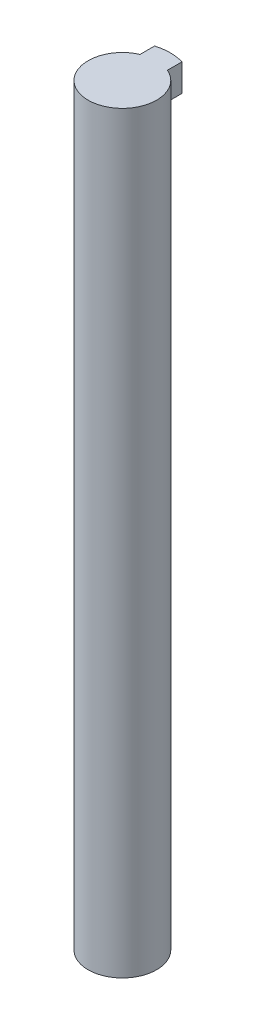
ISO-10303-21;
HEADER;
FILE_DESCRIPTION(('STEP AP214'),'2;1');
FILE_NAME('part.step','',(''),(''),'','','');
FILE_SCHEMA(('AUTOMOTIVE_DESIGN { 1 0 10303 214 1 1 1 1 }'));
ENDSEC;
DATA;
#1=APPLICATION_CONTEXT('core data for automotive mechanical design processes');
#2=APPLICATION_PROTOCOL_DEFINITION('international standard','automotive_design',2000,#1);
#3=PRODUCT_CONTEXT('',#1,'mechanical');
#4=PRODUCT('Part','Part','',(#3));
#5=PRODUCT_RELATED_PRODUCT_CATEGORY('part','',(#4));
#6=PRODUCT_DEFINITION_FORMATION('','',#4);
#7=PRODUCT_DEFINITION_CONTEXT('part definition',#1,'design');
#8=PRODUCT_DEFINITION('design','',#6,#7);
#9=PRODUCT_DEFINITION_SHAPE('','',#8);
#10=(LENGTH_UNIT() NAMED_UNIT(*) SI_UNIT(.MILLI.,.METRE.));
#11=(NAMED_UNIT(*) PLANE_ANGLE_UNIT() SI_UNIT($,.RADIAN.));
#12=(NAMED_UNIT(*) SI_UNIT($,.STERADIAN.) SOLID_ANGLE_UNIT());
#13=UNCERTAINTY_MEASURE_WITH_UNIT(LENGTH_MEASURE(1.E-05),#10,'distance_accuracy_value','');
#14=(GEOMETRIC_REPRESENTATION_CONTEXT(3) GLOBAL_UNCERTAINTY_ASSIGNED_CONTEXT((#13)) GLOBAL_UNIT_ASSIGNED_CONTEXT((#10,
#11,#12)) REPRESENTATION_CONTEXT('',''));
#15=CARTESIAN_POINT('',(0.,0.,0.));
#16=DIRECTION('',(0.,0.,1.));
#17=DIRECTION('',(1.,0.,0.));
#18=AXIS2_PLACEMENT_3D('',#15,#16,#17);
#19=CARTESIAN_POINT('',(0.,69.85,0.));
#20=DIRECTION('',(0.,-1.,0.));
#21=DIRECTION('',(0.,0.,-1.));
#22=AXIS2_PLACEMENT_3D('',#19,#20,#21);
#23=CYLINDRICAL_SURFACE('',#22,3.175);
#24=CARTESIAN_POINT('',(0.,67.31,0.));
#25=DIRECTION('',(0.,-1.,0.));
#26=DIRECTION('',(0.,0.,1.));
#27=AXIS2_PLACEMENT_3D('',#24,#25,#26);
#28=CIRCLE('',#27,3.175);
#29=CARTESIAN_POINT('',(-1.27,67.31,-2.90993556629696));
#30=VERTEX_POINT('',#29);
#31=CARTESIAN_POINT('',(1.27,67.31,-2.90993556629696));
#32=VERTEX_POINT('',#31);
#33=EDGE_CURVE('E81',#30,#32,#28,.T.);
#34=ORIENTED_EDGE('',*,*,#33,.T.);
#35=DIRECTION('',(0.,1.,0.));
#36=VECTOR('',#35,1.);
#37=CARTESIAN_POINT('',(1.27,67.31,-2.90993556629696));
#38=LINE('',#37,#36);
#39=CARTESIAN_POINT('',(1.27,69.85,-2.90993556629696));
#40=VERTEX_POINT('',#39);
#41=EDGE_CURVE('E95',#32,#40,#38,.T.);
#42=ORIENTED_EDGE('',*,*,#41,.T.);
#43=CARTESIAN_POINT('',(0.,69.85,0.));
#44=DIRECTION('',(0.,1.,0.));
#45=DIRECTION('',(0.,0.,1.));
#46=AXIS2_PLACEMENT_3D('',#43,#44,#45);
#47=CIRCLE('',#46,3.175);
#48=CARTESIAN_POINT('',(-1.27,69.85,-2.90993556629696));
#49=VERTEX_POINT('',#48);
#50=EDGE_CURVE('E11',#49,#40,#47,.T.);
#51=ORIENTED_EDGE('',*,*,#50,.F.);
#52=DIRECTION('',(0.,1.,0.));
#53=VECTOR('',#52,1.);
#54=CARTESIAN_POINT('',(-1.27,67.31,-2.90993556629696));
#55=LINE('',#54,#53);
#56=EDGE_CURVE('E90',#30,#49,#55,.T.);
#57=ORIENTED_EDGE('',*,*,#56,.F.);
#58=EDGE_LOOP('',(#34,#42,#51,#57));
#59=FACE_BOUND('',#58,.T.);
#60=CARTESIAN_POINT('',(0.,0.,0.));
#61=DIRECTION('',(0.,1.,0.));
#62=DIRECTION('',(0.,0.,1.));
#63=AXIS2_PLACEMENT_3D('',#60,#61,#62);
#64=CIRCLE('',#63,3.175);
#65=CARTESIAN_POINT('',(0.,0.,3.175));
#66=VERTEX_POINT('',#65);
#67=EDGE_CURVE('E36',#66,#66,#64,.T.);
#68=ORIENTED_EDGE('',*,*,#67,.T.);
#69=EDGE_LOOP('',(#68));
#70=FACE_BOUND('',#69,.T.);
#71=ADVANCED_FACE('F33',(#59,#70),#23,.T.);
#72=CARTESIAN_POINT('',(0.,69.85,0.));
#73=DIRECTION('',(0.,1.,0.));
#74=DIRECTION('',(0.,0.,1.));
#75=AXIS2_PLACEMENT_3D('',#72,#73,#74);
#76=PLANE('',#75);
#77=ORIENTED_EDGE('',*,*,#50,.T.);
#78=DIRECTION('',(0.,0.,-1.));
#79=VECTOR('',#78,1.);
#80=CARTESIAN_POINT('',(1.27,69.85,-4.2597094971371));
#81=LINE('',#80,#79);
#82=CARTESIAN_POINT('',(1.27,69.85,-4.2597094971371));
#83=VERTEX_POINT('',#82);
#84=EDGE_CURVE('E101',#40,#83,#81,.T.);
#85=ORIENTED_EDGE('',*,*,#84,.T.);
#86=CARTESIAN_POINT('',(0.,69.85,0.));
#87=DIRECTION('',(0.,1.,0.));
#88=DIRECTION('',(0.,0.,1.));
#89=AXIS2_PLACEMENT_3D('',#86,#87,#88);
#90=CIRCLE('',#89,4.445);
#91=CARTESIAN_POINT('',(-1.27,69.85,-4.2597094971371));
#92=VERTEX_POINT('',#91);
#93=EDGE_CURVE('E105',#83,#92,#90,.T.);
#94=ORIENTED_EDGE('',*,*,#93,.T.);
#95=DIRECTION('',(0.,0.,1.));
#96=VECTOR('',#95,1.);
#97=CARTESIAN_POINT('',(-1.27,69.85,-4.2597094971371));
#98=LINE('',#97,#96);
#99=EDGE_CURVE('E46',#92,#49,#98,.T.);
#100=ORIENTED_EDGE('',*,*,#99,.T.);
#101=EDGE_LOOP('',(#77,#85,#94,#100));
#102=FACE_BOUND('',#101,.T.);
#103=ADVANCED_FACE('F110',(#102),#76,.T.);
#104=CARTESIAN_POINT('',(0.,0.,0.));
#105=DIRECTION('',(0.,1.,0.));
#106=DIRECTION('',(0.,0.,1.));
#107=AXIS2_PLACEMENT_3D('',#104,#105,#106);
#108=PLANE('',#107);
#109=ORIENTED_EDGE('',*,*,#67,.F.);
#110=EDGE_LOOP('',(#109));
#111=FACE_BOUND('',#110,.T.);
#112=ADVANCED_FACE('F112',(#111),#108,.F.);
#113=CARTESIAN_POINT('',(0.,67.31,0.));
#114=DIRECTION('',(0.,1.,0.));
#115=DIRECTION('',(0.,0.,1.));
#116=AXIS2_PLACEMENT_3D('',#113,#114,#115);
#117=CYLINDRICAL_SURFACE('',#116,4.445);
#118=ORIENTED_EDGE('',*,*,#93,.F.);
#119=DIRECTION('',(0.,1.,0.));
#120=VECTOR('',#119,1.);
#121=CARTESIAN_POINT('',(1.27,67.31,-4.2597094971371));
#122=LINE('',#121,#120);
#123=CARTESIAN_POINT('',(1.27,67.31,-4.2597094971371));
#124=VERTEX_POINT('',#123);
#125=EDGE_CURVE('E55',#124,#83,#122,.T.);
#126=ORIENTED_EDGE('',*,*,#125,.F.);
#127=CARTESIAN_POINT('',(0.,67.31,0.));
#128=DIRECTION('',(0.,1.,0.));
#129=DIRECTION('',(0.,0.,1.));
#130=AXIS2_PLACEMENT_3D('',#127,#128,#129);
#131=CIRCLE('',#130,4.445);
#132=CARTESIAN_POINT('',(-1.27,67.31,-4.2597094971371));
#133=VERTEX_POINT('',#132);
#134=EDGE_CURVE('E92',#124,#133,#131,.T.);
#135=ORIENTED_EDGE('',*,*,#134,.T.);
#136=DIRECTION('',(0.,1.,0.));
#137=VECTOR('',#136,1.);
#138=CARTESIAN_POINT('',(-1.27,67.31,-4.2597094971371));
#139=LINE('',#138,#137);
#140=EDGE_CURVE('E75',#133,#92,#139,.T.);
#141=ORIENTED_EDGE('',*,*,#140,.T.);
#142=EDGE_LOOP('',(#118,#126,#135,#141));
#143=FACE_BOUND('',#142,.T.);
#144=ADVANCED_FACE('F108',(#143),#117,.T.);
#145=CARTESIAN_POINT('',(1.27,67.31,-4.2597094971371));
#146=DIRECTION('',(1.,0.,0.));
#147=DIRECTION('',(0.,0.,-1.));
#148=AXIS2_PLACEMENT_3D('',#145,#146,#147);
#149=PLANE('',#148);
#150=ORIENTED_EDGE('',*,*,#84,.F.);
#151=ORIENTED_EDGE('',*,*,#41,.F.);
#152=DIRECTION('',(0.,0.,-1.));
#153=VECTOR('',#152,1.);
#154=CARTESIAN_POINT('',(1.27,67.31,-4.2597094971371));
#155=LINE('',#154,#153);
#156=EDGE_CURVE('E84',#32,#124,#155,.T.);
#157=ORIENTED_EDGE('',*,*,#156,.T.);
#158=ORIENTED_EDGE('',*,*,#125,.T.);
#159=EDGE_LOOP('',(#150,#151,#157,#158));
#160=FACE_BOUND('',#159,.T.);
#161=ADVANCED_FACE('F109',(#160),#149,.T.);
#162=CARTESIAN_POINT('',(-1.27,67.31,-4.2597094971371));
#163=DIRECTION('',(-1.,0.,0.));
#164=DIRECTION('',(0.,0.,1.));
#165=AXIS2_PLACEMENT_3D('',#162,#163,#164);
#166=PLANE('',#165);
#167=ORIENTED_EDGE('',*,*,#99,.F.);
#168=ORIENTED_EDGE('',*,*,#140,.F.);
#169=DIRECTION('',(0.,0.,1.));
#170=VECTOR('',#169,1.);
#171=CARTESIAN_POINT('',(-1.27,67.31,-4.2597094971371));
#172=LINE('',#171,#170);
#173=EDGE_CURVE('E83',#133,#30,#172,.T.);
#174=ORIENTED_EDGE('',*,*,#173,.T.);
#175=ORIENTED_EDGE('',*,*,#56,.T.);
#176=EDGE_LOOP('',(#167,#168,#174,#175));
#177=FACE_BOUND('',#176,.T.);
#178=ADVANCED_FACE('F89',(#177),#166,.T.);
#179=CARTESIAN_POINT('',(0.,67.31,0.));
#180=DIRECTION('',(0.,1.,0.));
#181=DIRECTION('',(0.,0.,1.));
#182=AXIS2_PLACEMENT_3D('',#179,#180,#181);
#183=PLANE('',#182);
#184=ORIENTED_EDGE('',*,*,#134,.F.);
#185=ORIENTED_EDGE('',*,*,#156,.F.);
#186=ORIENTED_EDGE('',*,*,#33,.F.);
#187=ORIENTED_EDGE('',*,*,#173,.F.);
#188=EDGE_LOOP('',(#184,#185,#186,#187));
#189=FACE_BOUND('',#188,.T.);
#190=ADVANCED_FACE('F82',(#189),#183,.F.);
#191=CLOSED_SHELL('',(#71,#103,#112,#144,#161,#178,#190));
#192=MANIFOLD_SOLID_BREP('B2',#191);
#193=ADVANCED_BREP_SHAPE_REPRESENTATION('',(#18,#192),#14);
#194=SHAPE_DEFINITION_REPRESENTATION(#9,#193);
ENDSEC;
END-ISO-10303-21;
